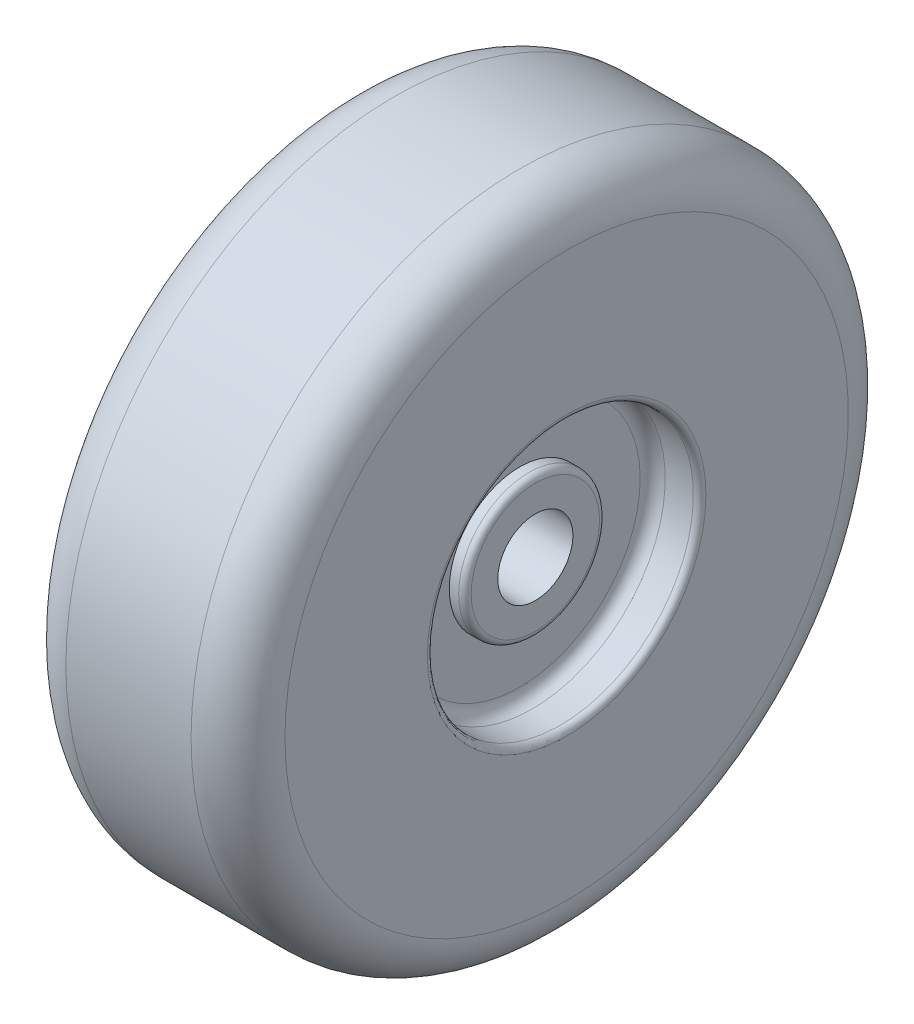
ISO-10303-21;
HEADER;
FILE_DESCRIPTION(('STEP AP214'),'2;1');
FILE_NAME('part.step','',(''),(''),'','','');
FILE_SCHEMA(('AUTOMOTIVE_DESIGN { 1 0 10303 214 1 1 1 1 }'));
ENDSEC;
DATA;
#1=APPLICATION_CONTEXT('core data for automotive mechanical design processes');
#2=APPLICATION_PROTOCOL_DEFINITION('international standard','automotive_design',2000,#1);
#3=PRODUCT_CONTEXT('',#1,'mechanical');
#4=PRODUCT('Part','Part','',(#3));
#5=PRODUCT_RELATED_PRODUCT_CATEGORY('part','',(#4));
#6=PRODUCT_DEFINITION_FORMATION('','',#4);
#7=PRODUCT_DEFINITION_CONTEXT('part definition',#1,'design');
#8=PRODUCT_DEFINITION('design','',#6,#7);
#9=PRODUCT_DEFINITION_SHAPE('','',#8);
#10=(LENGTH_UNIT() NAMED_UNIT(*) SI_UNIT(.MILLI.,.METRE.));
#11=(NAMED_UNIT(*) PLANE_ANGLE_UNIT() SI_UNIT($,.RADIAN.));
#12=(NAMED_UNIT(*) SI_UNIT($,.STERADIAN.) SOLID_ANGLE_UNIT());
#13=UNCERTAINTY_MEASURE_WITH_UNIT(LENGTH_MEASURE(1.E-05),#10,'distance_accuracy_value','');
#14=(GEOMETRIC_REPRESENTATION_CONTEXT(3) GLOBAL_UNCERTAINTY_ASSIGNED_CONTEXT((#13)) GLOBAL_UNIT_ASSIGNED_CONTEXT((#10,
#11,#12)) REPRESENTATION_CONTEXT('',''));
#15=CARTESIAN_POINT('',(0.,0.,0.));
#16=DIRECTION('',(0.,0.,1.));
#17=DIRECTION('',(1.,0.,0.));
#18=AXIS2_PLACEMENT_3D('',#15,#16,#17);
#19=CARTESIAN_POINT('',(2.4,0.,0.));
#20=DIRECTION('',(-1.,0.,0.));
#21=DIRECTION('',(0.,0.,1.));
#22=AXIS2_PLACEMENT_3D('',#19,#20,#21);
#23=TOROIDAL_SURFACE('',#22,3.85,0.4);
#24=CARTESIAN_POINT('',(2.4,0.,0.));
#25=DIRECTION('',(-1.,0.,0.));
#26=DIRECTION('',(0.,0.,1.));
#27=AXIS2_PLACEMENT_3D('',#24,#25,#26);
#28=CIRCLE('',#27,4.25);
#29=CARTESIAN_POINT('',(2.4,0.,4.25));
#30=VERTEX_POINT('',#29);
#31=EDGE_CURVE('E10',#30,#30,#28,.T.);
#32=ORIENTED_EDGE('',*,*,#31,.F.);
#33=EDGE_LOOP('',(#32));
#34=FACE_BOUND('',#33,.T.);
#35=CARTESIAN_POINT('',(2.,0.,0.));
#36=DIRECTION('',(-1.,0.,0.));
#37=DIRECTION('',(0.,0.,1.));
#38=AXIS2_PLACEMENT_3D('',#35,#36,#37);
#39=CIRCLE('',#38,3.85);
#40=CARTESIAN_POINT('',(2.,0.,3.85));
#41=VERTEX_POINT('',#40);
#42=EDGE_CURVE('E95',#41,#41,#39,.T.);
#43=ORIENTED_EDGE('',*,*,#42,.T.);
#44=EDGE_LOOP('',(#43));
#45=FACE_BOUND('',#44,.T.);
#46=ADVANCED_FACE('F31',(#34,#45),#23,.F.);
#47=CARTESIAN_POINT('',(0.,0.,0.));
#48=DIRECTION('',(-1.,0.,0.));
#49=DIRECTION('',(0.,0.,1.));
#50=AXIS2_PLACEMENT_3D('',#47,#48,#49);
#51=CYLINDRICAL_SURFACE('',#50,4.25);
#52=CARTESIAN_POINT('',(3.3,0.,0.));
#53=DIRECTION('',(-1.,0.,0.));
#54=DIRECTION('',(0.,0.,1.));
#55=AXIS2_PLACEMENT_3D('',#52,#53,#54);
#56=CIRCLE('',#55,4.25);
#57=CARTESIAN_POINT('',(3.3,0.,4.25));
#58=VERTEX_POINT('',#57);
#59=EDGE_CURVE('E37',#58,#58,#56,.T.);
#60=ORIENTED_EDGE('',*,*,#59,.F.);
#61=EDGE_LOOP('',(#60));
#62=FACE_BOUND('',#61,.T.);
#63=ORIENTED_EDGE('',*,*,#31,.T.);
#64=EDGE_LOOP('',(#63));
#65=FACE_BOUND('',#64,.T.);
#66=ADVANCED_FACE('F204',(#62,#65),#51,.F.);
#67=CARTESIAN_POINT('',(3.3,0.,0.));
#68=DIRECTION('',(-1.,0.,0.));
#69=DIRECTION('',(0.,0.,1.));
#70=AXIS2_PLACEMENT_3D('',#67,#68,#69);
#71=TOROIDAL_SURFACE('',#70,4.45,0.2);
#72=CARTESIAN_POINT('',(3.5,0.,0.));
#73=DIRECTION('',(-1.,0.,0.));
#74=DIRECTION('',(0.,0.,1.));
#75=AXIS2_PLACEMENT_3D('',#72,#73,#74);
#76=CIRCLE('',#75,4.45);
#77=CARTESIAN_POINT('',(3.5,0.,4.45));
#78=VERTEX_POINT('',#77);
#79=EDGE_CURVE('E41',#78,#78,#76,.T.);
#80=ORIENTED_EDGE('',*,*,#79,.F.);
#81=EDGE_LOOP('',(#80));
#82=FACE_BOUND('',#81,.T.);
#83=ORIENTED_EDGE('',*,*,#59,.T.);
#84=EDGE_LOOP('',(#83));
#85=FACE_BOUND('',#84,.T.);
#86=ADVANCED_FACE('F199',(#82,#85),#71,.T.);
#87=CARTESIAN_POINT('',(3.5,8.99999999999999,0.));
#88=DIRECTION('',(-1.,0.,0.));
#89=DIRECTION('',(0.,0.,1.));
#90=AXIS2_PLACEMENT_3D('',#87,#88,#89);
#91=PLANE('',#90);
#92=CARTESIAN_POINT('',(3.5,0.,0.));
#93=DIRECTION('',(-1.,0.,0.));
#94=DIRECTION('',(0.,0.,1.));
#95=AXIS2_PLACEMENT_3D('',#92,#93,#94);
#96=CIRCLE('',#95,8.99999999999999);
#97=CARTESIAN_POINT('',(3.5,0.,8.99999999999999));
#98=VERTEX_POINT('',#97);
#99=EDGE_CURVE('E45',#98,#98,#96,.T.);
#100=ORIENTED_EDGE('',*,*,#99,.F.);
#101=EDGE_LOOP('',(#100));
#102=FACE_BOUND('',#101,.T.);
#103=ORIENTED_EDGE('',*,*,#79,.T.);
#104=EDGE_LOOP('',(#103));
#105=FACE_BOUND('',#104,.T.);
#106=ADVANCED_FACE('F193',(#102,#105),#91,.F.);
#107=CARTESIAN_POINT('',(2.,0.,0.));
#108=DIRECTION('',(-1.,0.,0.));
#109=DIRECTION('',(0.,0.,1.));
#110=AXIS2_PLACEMENT_3D('',#107,#108,#109);
#111=TOROIDAL_SURFACE('',#110,9.,1.5);
#112=CARTESIAN_POINT('',(1.99999999999999,0.,0.));
#113=DIRECTION('',(-1.,0.,0.));
#114=DIRECTION('',(0.,0.,1.));
#115=AXIS2_PLACEMENT_3D('',#112,#113,#114);
#116=CIRCLE('',#115,10.5);
#117=CARTESIAN_POINT('',(1.99999999999999,0.,10.5));
#118=VERTEX_POINT('',#117);
#119=EDGE_CURVE('E50',#118,#118,#116,.T.);
#120=ORIENTED_EDGE('',*,*,#119,.F.);
#121=EDGE_LOOP('',(#120));
#122=FACE_BOUND('',#121,.T.);
#123=ORIENTED_EDGE('',*,*,#99,.T.);
#124=EDGE_LOOP('',(#123));
#125=FACE_BOUND('',#124,.T.);
#126=ADVANCED_FACE('F187',(#122,#125),#111,.T.);
#127=CARTESIAN_POINT('',(0.,0.,0.));
#128=DIRECTION('',(-1.,0.,0.));
#129=DIRECTION('',(0.,0.,1.));
#130=AXIS2_PLACEMENT_3D('',#127,#128,#129);
#131=CYLINDRICAL_SURFACE('',#130,10.5);
#132=CARTESIAN_POINT('',(-1.99999999999999,0.,0.));
#133=DIRECTION('',(-1.,0.,0.));
#134=DIRECTION('',(0.,0.,1.));
#135=AXIS2_PLACEMENT_3D('',#132,#133,#134);
#136=CIRCLE('',#135,10.5);
#137=CARTESIAN_POINT('',(-1.99999999999999,0.,10.5));
#138=VERTEX_POINT('',#137);
#139=EDGE_CURVE('E53',#138,#138,#136,.T.);
#140=ORIENTED_EDGE('',*,*,#139,.F.);
#141=EDGE_LOOP('',(#140));
#142=FACE_BOUND('',#141,.T.);
#143=ORIENTED_EDGE('',*,*,#119,.T.);
#144=EDGE_LOOP('',(#143));
#145=FACE_BOUND('',#144,.T.);
#146=ADVANCED_FACE('F181',(#142,#145),#131,.T.);
#147=CARTESIAN_POINT('',(-2.,0.,0.));
#148=DIRECTION('',(-1.,0.,0.));
#149=DIRECTION('',(0.,0.,1.));
#150=AXIS2_PLACEMENT_3D('',#147,#148,#149);
#151=TOROIDAL_SURFACE('',#150,9.,1.5);
#152=CARTESIAN_POINT('',(-3.5,0.,0.));
#153=DIRECTION('',(-1.,0.,0.));
#154=DIRECTION('',(0.,0.,1.));
#155=AXIS2_PLACEMENT_3D('',#152,#153,#154);
#156=CIRCLE('',#155,8.99999999999999);
#157=CARTESIAN_POINT('',(-3.5,0.,8.99999999999999));
#158=VERTEX_POINT('',#157);
#159=EDGE_CURVE('E56',#158,#158,#156,.T.);
#160=ORIENTED_EDGE('',*,*,#159,.F.);
#161=EDGE_LOOP('',(#160));
#162=FACE_BOUND('',#161,.T.);
#163=ORIENTED_EDGE('',*,*,#139,.T.);
#164=EDGE_LOOP('',(#163));
#165=FACE_BOUND('',#164,.T.);
#166=ADVANCED_FACE('F175',(#162,#165),#151,.T.);
#167=CARTESIAN_POINT('',(-3.5,8.99999999999999,0.));
#168=DIRECTION('',(1.,0.,0.));
#169=DIRECTION('',(0.,0.,-1.));
#170=AXIS2_PLACEMENT_3D('',#167,#168,#169);
#171=PLANE('',#170);
#172=CARTESIAN_POINT('',(-3.5,0.,0.));
#173=DIRECTION('',(-1.,0.,0.));
#174=DIRECTION('',(0.,0.,1.));
#175=AXIS2_PLACEMENT_3D('',#172,#173,#174);
#176=CIRCLE('',#175,4.45);
#177=CARTESIAN_POINT('',(-3.5,0.,4.45));
#178=VERTEX_POINT('',#177);
#179=EDGE_CURVE('E59',#178,#178,#176,.T.);
#180=ORIENTED_EDGE('',*,*,#179,.F.);
#181=EDGE_LOOP('',(#180));
#182=FACE_BOUND('',#181,.T.);
#183=ORIENTED_EDGE('',*,*,#159,.T.);
#184=EDGE_LOOP('',(#183));
#185=FACE_BOUND('',#184,.T.);
#186=ADVANCED_FACE('F169',(#182,#185),#171,.F.);
#187=CARTESIAN_POINT('',(-3.3,0.,0.));
#188=DIRECTION('',(-1.,0.,0.));
#189=DIRECTION('',(0.,0.,1.));
#190=AXIS2_PLACEMENT_3D('',#187,#188,#189);
#191=TOROIDAL_SURFACE('',#190,4.45,0.2);
#192=CARTESIAN_POINT('',(-3.3,0.,0.));
#193=DIRECTION('',(-1.,0.,0.));
#194=DIRECTION('',(0.,0.,1.));
#195=AXIS2_PLACEMENT_3D('',#192,#193,#194);
#196=CIRCLE('',#195,4.25);
#197=CARTESIAN_POINT('',(-3.3,0.,4.25));
#198=VERTEX_POINT('',#197);
#199=EDGE_CURVE('E62',#198,#198,#196,.T.);
#200=ORIENTED_EDGE('',*,*,#199,.F.);
#201=EDGE_LOOP('',(#200));
#202=FACE_BOUND('',#201,.T.);
#203=ORIENTED_EDGE('',*,*,#179,.T.);
#204=EDGE_LOOP('',(#203));
#205=FACE_BOUND('',#204,.T.);
#206=ADVANCED_FACE('F163',(#202,#205),#191,.T.);
#207=CARTESIAN_POINT('',(0.,0.,0.));
#208=DIRECTION('',(-1.,0.,0.));
#209=DIRECTION('',(0.,0.,1.));
#210=AXIS2_PLACEMENT_3D('',#207,#208,#209);
#211=CYLINDRICAL_SURFACE('',#210,4.25);
#212=CARTESIAN_POINT('',(-2.4,0.,0.));
#213=DIRECTION('',(-1.,0.,0.));
#214=DIRECTION('',(0.,0.,1.));
#215=AXIS2_PLACEMENT_3D('',#212,#213,#214);
#216=CIRCLE('',#215,4.25);
#217=CARTESIAN_POINT('',(-2.4,0.,4.25));
#218=VERTEX_POINT('',#217);
#219=EDGE_CURVE('E65',#218,#218,#216,.T.);
#220=ORIENTED_EDGE('',*,*,#219,.F.);
#221=EDGE_LOOP('',(#220));
#222=FACE_BOUND('',#221,.T.);
#223=ORIENTED_EDGE('',*,*,#199,.T.);
#224=EDGE_LOOP('',(#223));
#225=FACE_BOUND('',#224,.T.);
#226=ADVANCED_FACE('F157',(#222,#225),#211,.F.);
#227=CARTESIAN_POINT('',(-2.4,0.,0.));
#228=DIRECTION('',(-1.,0.,0.));
#229=DIRECTION('',(0.,0.,1.));
#230=AXIS2_PLACEMENT_3D('',#227,#228,#229);
#231=TOROIDAL_SURFACE('',#230,3.85,0.4);
#232=CARTESIAN_POINT('',(-2.,0.,0.));
#233=DIRECTION('',(-1.,0.,0.));
#234=DIRECTION('',(0.,0.,1.));
#235=AXIS2_PLACEMENT_3D('',#232,#233,#234);
#236=CIRCLE('',#235,3.85);
#237=CARTESIAN_POINT('',(-2.,0.,3.85));
#238=VERTEX_POINT('',#237);
#239=EDGE_CURVE('E68',#238,#238,#236,.T.);
#240=ORIENTED_EDGE('',*,*,#239,.F.);
#241=EDGE_LOOP('',(#240));
#242=FACE_BOUND('',#241,.T.);
#243=ORIENTED_EDGE('',*,*,#219,.T.);
#244=EDGE_LOOP('',(#243));
#245=FACE_BOUND('',#244,.T.);
#246=ADVANCED_FACE('F151',(#242,#245),#231,.F.);
#247=CARTESIAN_POINT('',(-2.,3.85,0.));
#248=DIRECTION('',(1.,0.,0.));
#249=DIRECTION('',(0.,0.,-1.));
#250=AXIS2_PLACEMENT_3D('',#247,#248,#249);
#251=PLANE('',#250);
#252=CARTESIAN_POINT('',(-2.,0.,0.));
#253=DIRECTION('',(-1.,0.,0.));
#254=DIRECTION('',(0.,0.,1.));
#255=AXIS2_PLACEMENT_3D('',#252,#253,#254);
#256=CIRCLE('',#255,2.25);
#257=CARTESIAN_POINT('',(-2.,0.,2.25));
#258=VERTEX_POINT('',#257);
#259=EDGE_CURVE('E71',#258,#258,#256,.T.);
#260=ORIENTED_EDGE('',*,*,#259,.F.);
#261=EDGE_LOOP('',(#260));
#262=FACE_BOUND('',#261,.T.);
#263=ORIENTED_EDGE('',*,*,#239,.T.);
#264=EDGE_LOOP('',(#263));
#265=FACE_BOUND('',#264,.T.);
#266=ADVANCED_FACE('F145',(#262,#265),#251,.F.);
#267=CARTESIAN_POINT('',(0.,0.,0.));
#268=DIRECTION('',(-1.,0.,0.));
#269=DIRECTION('',(0.,0.,1.));
#270=AXIS2_PLACEMENT_3D('',#267,#268,#269);
#271=CYLINDRICAL_SURFACE('',#270,2.25);
#272=CARTESIAN_POINT('',(-2.3,0.,0.));
#273=DIRECTION('',(-1.,0.,0.));
#274=DIRECTION('',(0.,0.,1.));
#275=AXIS2_PLACEMENT_3D('',#272,#273,#274);
#276=CIRCLE('',#275,2.25);
#277=CARTESIAN_POINT('',(-2.3,0.,2.25));
#278=VERTEX_POINT('',#277);
#279=EDGE_CURVE('E74',#278,#278,#276,.T.);
#280=ORIENTED_EDGE('',*,*,#279,.F.);
#281=EDGE_LOOP('',(#280));
#282=FACE_BOUND('',#281,.T.);
#283=ORIENTED_EDGE('',*,*,#259,.T.);
#284=EDGE_LOOP('',(#283));
#285=FACE_BOUND('',#284,.T.);
#286=ADVANCED_FACE('F139',(#282,#285),#271,.T.);
#287=CARTESIAN_POINT('',(-2.3,0.,0.));
#288=DIRECTION('',(-1.,0.,0.));
#289=DIRECTION('',(0.,0.,1.));
#290=AXIS2_PLACEMENT_3D('',#287,#288,#289);
#291=TOROIDAL_SURFACE('',#290,2.05,0.2);
#292=CARTESIAN_POINT('',(-2.5,0.,0.));
#293=DIRECTION('',(-1.,0.,0.));
#294=DIRECTION('',(0.,0.,1.));
#295=AXIS2_PLACEMENT_3D('',#292,#293,#294);
#296=CIRCLE('',#295,2.05);
#297=CARTESIAN_POINT('',(-2.5,0.,2.05));
#298=VERTEX_POINT('',#297);
#299=EDGE_CURVE('E77',#298,#298,#296,.T.);
#300=ORIENTED_EDGE('',*,*,#299,.F.);
#301=EDGE_LOOP('',(#300));
#302=FACE_BOUND('',#301,.T.);
#303=ORIENTED_EDGE('',*,*,#279,.T.);
#304=EDGE_LOOP('',(#303));
#305=FACE_BOUND('',#304,.T.);
#306=ADVANCED_FACE('F133',(#302,#305),#291,.T.);
#307=CARTESIAN_POINT('',(-2.5,1.2,0.));
#308=DIRECTION('',(1.,0.,0.));
#309=DIRECTION('',(0.,0.,-1.));
#310=AXIS2_PLACEMENT_3D('',#307,#308,#309);
#311=PLANE('',#310);
#312=CARTESIAN_POINT('',(-2.5,0.,0.));
#313=DIRECTION('',(-1.,0.,0.));
#314=DIRECTION('',(0.,0.,1.));
#315=AXIS2_PLACEMENT_3D('',#312,#313,#314);
#316=CIRCLE('',#315,1.2);
#317=CARTESIAN_POINT('',(-2.5,0.,1.2));
#318=VERTEX_POINT('',#317);
#319=EDGE_CURVE('E80',#318,#318,#316,.T.);
#320=ORIENTED_EDGE('',*,*,#319,.F.);
#321=EDGE_LOOP('',(#320));
#322=FACE_BOUND('',#321,.T.);
#323=ORIENTED_EDGE('',*,*,#299,.T.);
#324=EDGE_LOOP('',(#323));
#325=FACE_BOUND('',#324,.T.);
#326=ADVANCED_FACE('F127',(#322,#325),#311,.F.);
#327=CARTESIAN_POINT('',(0.,0.,0.));
#328=DIRECTION('',(-1.,0.,0.));
#329=DIRECTION('',(0.,0.,1.));
#330=AXIS2_PLACEMENT_3D('',#327,#328,#329);
#331=CYLINDRICAL_SURFACE('',#330,1.2);
#332=CARTESIAN_POINT('',(2.5,0.,0.));
#333=DIRECTION('',(-1.,0.,0.));
#334=DIRECTION('',(0.,0.,1.));
#335=AXIS2_PLACEMENT_3D('',#332,#333,#334);
#336=CIRCLE('',#335,1.2);
#337=CARTESIAN_POINT('',(2.5,0.,1.2));
#338=VERTEX_POINT('',#337);
#339=EDGE_CURVE('E83',#338,#338,#336,.T.);
#340=ORIENTED_EDGE('',*,*,#339,.F.);
#341=EDGE_LOOP('',(#340));
#342=FACE_BOUND('',#341,.T.);
#343=ORIENTED_EDGE('',*,*,#319,.T.);
#344=EDGE_LOOP('',(#343));
#345=FACE_BOUND('',#344,.T.);
#346=ADVANCED_FACE('F121',(#342,#345),#331,.F.);
#347=CARTESIAN_POINT('',(2.5,1.2,0.));
#348=DIRECTION('',(-1.,0.,0.));
#349=DIRECTION('',(0.,0.,1.));
#350=AXIS2_PLACEMENT_3D('',#347,#348,#349);
#351=PLANE('',#350);
#352=CARTESIAN_POINT('',(2.5,0.,0.));
#353=DIRECTION('',(-1.,0.,0.));
#354=DIRECTION('',(0.,0.,1.));
#355=AXIS2_PLACEMENT_3D('',#352,#353,#354);
#356=CIRCLE('',#355,2.05);
#357=CARTESIAN_POINT('',(2.5,0.,2.05));
#358=VERTEX_POINT('',#357);
#359=EDGE_CURVE('E86',#358,#358,#356,.T.);
#360=ORIENTED_EDGE('',*,*,#359,.F.);
#361=EDGE_LOOP('',(#360));
#362=FACE_BOUND('',#361,.T.);
#363=ORIENTED_EDGE('',*,*,#339,.T.);
#364=EDGE_LOOP('',(#363));
#365=FACE_BOUND('',#364,.T.);
#366=ADVANCED_FACE('F115',(#362,#365),#351,.F.);
#367=CARTESIAN_POINT('',(2.3,0.,0.));
#368=DIRECTION('',(-1.,0.,0.));
#369=DIRECTION('',(0.,0.,1.));
#370=AXIS2_PLACEMENT_3D('',#367,#368,#369);
#371=TOROIDAL_SURFACE('',#370,2.05,0.2);
#372=CARTESIAN_POINT('',(2.3,0.,0.));
#373=DIRECTION('',(-1.,0.,0.));
#374=DIRECTION('',(0.,0.,1.));
#375=AXIS2_PLACEMENT_3D('',#372,#373,#374);
#376=CIRCLE('',#375,2.25);
#377=CARTESIAN_POINT('',(2.3,0.,2.25));
#378=VERTEX_POINT('',#377);
#379=EDGE_CURVE('E89',#378,#378,#376,.T.);
#380=ORIENTED_EDGE('',*,*,#379,.F.);
#381=EDGE_LOOP('',(#380));
#382=FACE_BOUND('',#381,.T.);
#383=ORIENTED_EDGE('',*,*,#359,.T.);
#384=EDGE_LOOP('',(#383));
#385=FACE_BOUND('',#384,.T.);
#386=ADVANCED_FACE('F109',(#382,#385),#371,.T.);
#387=CARTESIAN_POINT('',(0.,0.,0.));
#388=DIRECTION('',(-1.,0.,0.));
#389=DIRECTION('',(0.,0.,1.));
#390=AXIS2_PLACEMENT_3D('',#387,#388,#389);
#391=CYLINDRICAL_SURFACE('',#390,2.25);
#392=CARTESIAN_POINT('',(2.,0.,0.));
#393=DIRECTION('',(-1.,0.,0.));
#394=DIRECTION('',(0.,0.,1.));
#395=AXIS2_PLACEMENT_3D('',#392,#393,#394);
#396=CIRCLE('',#395,2.25);
#397=CARTESIAN_POINT('',(2.,0.,2.25));
#398=VERTEX_POINT('',#397);
#399=EDGE_CURVE('E92',#398,#398,#396,.T.);
#400=ORIENTED_EDGE('',*,*,#399,.F.);
#401=EDGE_LOOP('',(#400));
#402=FACE_BOUND('',#401,.T.);
#403=ORIENTED_EDGE('',*,*,#379,.T.);
#404=EDGE_LOOP('',(#403));
#405=FACE_BOUND('',#404,.T.);
#406=ADVANCED_FACE('F103',(#402,#405),#391,.T.);
#407=CARTESIAN_POINT('',(2.,3.85,0.));
#408=DIRECTION('',(-1.,0.,0.));
#409=DIRECTION('',(0.,0.,1.));
#410=AXIS2_PLACEMENT_3D('',#407,#408,#409);
#411=PLANE('',#410);
#412=ORIENTED_EDGE('',*,*,#42,.F.);
#413=EDGE_LOOP('',(#412));
#414=FACE_BOUND('',#413,.T.);
#415=ORIENTED_EDGE('',*,*,#399,.T.);
#416=EDGE_LOOP('',(#415));
#417=FACE_BOUND('',#416,.T.);
#418=ADVANCED_FACE('F100',(#414,#417),#411,.F.);
#419=CLOSED_SHELL('',(#46,#66,#86,#106,#126,#146,#166,#186,#206,#226,#246,#266,#286,#306,#326,
#346,#366,#386,#406,#418));
#420=MANIFOLD_SOLID_BREP('B2',#419);
#421=ADVANCED_BREP_SHAPE_REPRESENTATION('',(#18,#420),#14);
#422=SHAPE_DEFINITION_REPRESENTATION(#9,#421);
ENDSEC;
END-ISO-10303-21;
